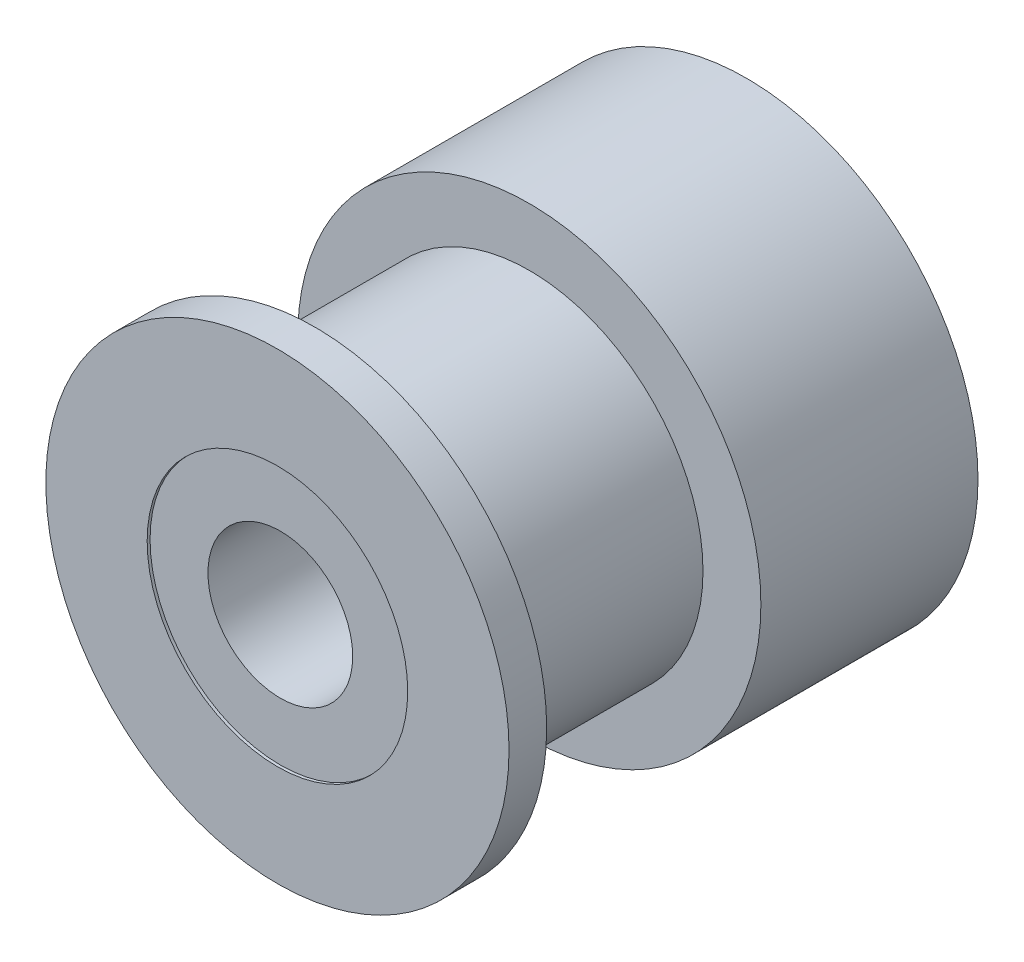
ISO-10303-21;
HEADER;
FILE_DESCRIPTION(('STEP AP214'),'2;1');
FILE_NAME('part.step','',(''),(''),'','','');
FILE_SCHEMA(('AUTOMOTIVE_DESIGN { 1 0 10303 214 1 1 1 1 }'));
ENDSEC;
DATA;
#1=APPLICATION_CONTEXT('core data for automotive mechanical design processes');
#2=APPLICATION_PROTOCOL_DEFINITION('international standard','automotive_design',2000,#1);
#3=PRODUCT_CONTEXT('',#1,'mechanical');
#4=PRODUCT('Part','Part','',(#3));
#5=PRODUCT_RELATED_PRODUCT_CATEGORY('part','',(#4));
#6=PRODUCT_DEFINITION_FORMATION('','',#4);
#7=PRODUCT_DEFINITION_CONTEXT('part definition',#1,'design');
#8=PRODUCT_DEFINITION('design','',#6,#7);
#9=PRODUCT_DEFINITION_SHAPE('','',#8);
#10=(LENGTH_UNIT() NAMED_UNIT(*) SI_UNIT(.MILLI.,.METRE.));
#11=(NAMED_UNIT(*) PLANE_ANGLE_UNIT() SI_UNIT($,.RADIAN.));
#12=(NAMED_UNIT(*) SI_UNIT($,.STERADIAN.) SOLID_ANGLE_UNIT());
#13=UNCERTAINTY_MEASURE_WITH_UNIT(LENGTH_MEASURE(1.E-05),#10,'distance_accuracy_value','');
#14=(GEOMETRIC_REPRESENTATION_CONTEXT(3) GLOBAL_UNCERTAINTY_ASSIGNED_CONTEXT((#13)) GLOBAL_UNIT_ASSIGNED_CONTEXT((#10,
#11,#12)) REPRESENTATION_CONTEXT('',''));
#15=CARTESIAN_POINT('',(0.,0.,0.));
#16=DIRECTION('',(0.,0.,1.));
#17=DIRECTION('',(1.,0.,0.));
#18=AXIS2_PLACEMENT_3D('',#15,#16,#17);
#19=CARTESIAN_POINT('',(0.,0.,-3.8));
#20=DIRECTION('',(0.,0.,1.));
#21=DIRECTION('',(1.,0.,0.));
#22=AXIS2_PLACEMENT_3D('',#19,#20,#21);
#23=CYLINDRICAL_SURFACE('',#22,2.5);
#24=CARTESIAN_POINT('',(0.,-2.5,5.25));
#25=CARTESIAN_POINT('',(-0.0767298334620159,-2.49999625789732,5.24999590899012));
#26=CARTESIAN_POINT('',(-0.153582320644178,-2.4964290461501,5.24407132907373));
#27=CARTESIAN_POINT('',(-0.304975509530679,-2.48249903608568,5.22067568048467));
#28=CARTESIAN_POINT('',(-0.379510034596047,-2.47211948032719,5.20317613814577));
#29=CARTESIAN_POINT('',(-0.523751827790836,-2.44561558054488,5.15761363883314));
#30=CARTESIAN_POINT('',(-0.593481028226566,-2.42951973272944,5.12960304183684));
#31=CARTESIAN_POINT('',(-0.727030318214659,-2.39295367626407,5.06413966685897));
#32=CARTESIAN_POINT('',(-0.790851869416383,-2.37248455380255,5.02668923303125));
#33=CARTESIAN_POINT('',(-0.916299278999315,-2.32705360719088,4.94022517329142));
#34=CARTESIAN_POINT('',(-0.977384020081415,-2.30186792195985,4.89054630464861));
#35=CARTESIAN_POINT('',(-1.09088270411891,-2.25030439279634,4.78253279617173));
#36=CARTESIAN_POINT('',(-1.14328534948112,-2.22392505153571,4.72418706281268));
#37=CARTESIAN_POINT('',(-1.24444996762974,-2.1691106699591,4.59207648950327));
#38=CARTESIAN_POINT('',(-1.29197766378809,-2.14082017703649,4.51729822901871));
#39=CARTESIAN_POINT('',(-1.37361437764896,-2.08938301412124,4.35915342675689));
#40=CARTESIAN_POINT('',(-1.4077451733516,-2.06622802273938,4.27580110375243));
#41=CARTESIAN_POINT('',(-1.45440601714221,-2.0335462966093,4.12340354934676));
#42=CARTESIAN_POINT('',(-1.47016197246826,-2.02207883137591,4.05576400138968));
#43=CARTESIAN_POINT('',(-1.49216172340475,-2.00590308295503,3.91819628416964));
#44=CARTESIAN_POINT('',(-1.49841734556836,-2.00118639643759,3.84827107124551));
#45=CARTESIAN_POINT('',(-1.50105508796009,-1.99920922463856,3.70798850578266));
#46=CARTESIAN_POINT('',(-1.49741783408419,-2.00196337012718,3.6376305749068));
#47=CARTESIAN_POINT('',(-1.48046060478828,-2.01453261443741,3.49872122457241));
#48=CARTESIAN_POINT('',(-1.46713334620103,-2.02435302432226,3.43017120415256));
#49=CARTESIAN_POINT('',(-1.43173921881792,-2.04953186944258,3.2974697578719));
#50=CARTESIAN_POINT('',(-1.40978748666087,-2.06481711652537,3.23327294607552));
#51=CARTESIAN_POINT('',(-1.35795061770837,-2.09927051350828,3.10930500907188));
#52=CARTESIAN_POINT('',(-1.32806257259705,-2.11844008623465,3.04953551657607));
#53=CARTESIAN_POINT('',(-1.25517983184583,-2.16255327268985,2.9250159028772));
#54=CARTESIAN_POINT('',(-1.21080724397723,-2.18792043372992,2.86122190704507));
#55=CARTESIAN_POINT('',(-1.11291092784003,-2.23930599764381,2.74132351633298));
#56=CARTESIAN_POINT('',(-1.05937845100579,-2.26532500262149,2.68522656602349));
#57=CARTESIAN_POINT('',(-0.935811834382966,-2.31935504958317,2.57438701817824));
#58=CARTESIAN_POINT('',(-0.864517682704957,-2.34713836268532,2.52092269398401));
#59=CARTESIAN_POINT('',(-0.712276050459,-2.39772428433981,2.42687795280209));
#60=CARTESIAN_POINT('',(-0.631333763943564,-2.42052955425515,2.38629064621005));
#61=CARTESIAN_POINT('',(-0.467197585268206,-2.45730392066151,2.3220678172041));
#62=CARTESIAN_POINT('',(-0.38446762417358,-2.47173957439704,2.29752464428409));
#63=CARTESIAN_POINT('',(-0.215047895144639,-2.49218842813551,2.26298880259462));
#64=CARTESIAN_POINT('',(-0.128363005661319,-2.49821172952738,2.25297868224642));
#65=CARTESIAN_POINT('',(0.0337146143773965,-2.5009057037461,2.24849215232169));
#66=CARTESIAN_POINT('',(0.109042473418718,-2.49873521714286,2.25209114491483));
#67=CARTESIAN_POINT('',(0.25782940198606,-2.48778712087048,2.27042585307192));
#68=CARTESIAN_POINT('',(0.331288509376106,-2.47900964518037,2.28516134280581));
#69=CARTESIAN_POINT('',(0.472574932157612,-2.4559479244219,2.32454343281246));
#70=CARTESIAN_POINT('',(0.540495750928483,-2.44180275662555,2.34894034907347));
#71=CARTESIAN_POINT('',(0.671265749087262,-2.40913880862844,2.40667737636527));
#72=CARTESIAN_POINT('',(0.734113924963908,-2.39061916586511,2.44001925134667));
#73=CARTESIAN_POINT('',(0.860006262823863,-2.3484549623736,2.51855697920871));
#74=CARTESIAN_POINT('',(0.922394150456836,-2.3244780273988,2.56462382907839));
#75=CARTESIAN_POINT('',(1.03902603131014,-2.27474265574732,2.66539139348862));
#76=CARTESIAN_POINT('',(1.09326040273738,-2.2489821658636,2.72010215485254));
#77=CARTESIAN_POINT('',(1.19931996735579,-2.19445423909891,2.84491039003715));
#78=CARTESIAN_POINT('',(1.24991019630915,-2.16573241746291,2.9160838854655));
#79=CARTESIAN_POINT('',(1.33845238915667,-2.1121618206671,3.0672160245682));
#80=CARTESIAN_POINT('',(1.37641766769781,-2.0873089799769,3.14716529389278));
#81=CARTESIAN_POINT('',(1.43142578795776,-2.04984909240519,3.29624302230669));
#82=CARTESIAN_POINT('',(1.4512162533619,-2.03575659328729,3.36398031235859));
#83=CARTESIAN_POINT('',(1.48113663905972,-2.01409605743544,3.5025320780801));
#84=CARTESIAN_POINT('',(1.49127995297631,-2.00651897642721,3.57334214432783));
#85=CARTESIAN_POINT('',(1.50134130416631,-1.99900446616268,3.71637694759703));
#86=CARTESIAN_POINT('',(1.50122089107869,-1.99909576445937,3.78860599068704));
#87=CARTESIAN_POINT('',(1.49066472959328,-2.0069771789285,3.93189443560946));
#88=CARTESIAN_POINT('',(1.48022337215759,-2.0147714813882,4.00295318008059));
#89=CARTESIAN_POINT('',(1.45040174148913,-2.0363318524298,4.13848841757219));
#90=CARTESIAN_POINT('',(1.43147636845351,-2.0497921180558,4.20311709430687));
#91=CARTESIAN_POINT('',(1.38563242076993,-2.08105501960151,4.32833725447422));
#92=CARTESIAN_POINT('',(1.35871083588479,-2.09885929040482,4.38892720696055));
#93=CARTESIAN_POINT('',(1.29289245555732,-2.14012990550917,4.51431985722078));
#94=CARTESIAN_POINT('',(1.25279167675753,-2.16404587582639,4.57834110385431));
#95=CARTESIAN_POINT('',(1.16375698389085,-2.21320127030768,4.69938007261729));
#96=CARTESIAN_POINT('',(1.11481579607798,-2.23844177205021,4.75639196215255));
#97=CARTESIAN_POINT('',(1.00009777425734,-2.29225690291476,4.87135094913167));
#98=CARTESIAN_POINT('',(0.932876819313905,-2.32070308663658,4.92793107489619));
#99=CARTESIAN_POINT('',(0.78846243444559,-2.37365428872367,5.02909785586331));
#100=CARTESIAN_POINT('',(0.711265444501541,-2.39815789310936,5.07368021198479));
#101=CARTESIAN_POINT('',(0.551125230801456,-2.43985578654394,5.14778580757374));
#102=CARTESIAN_POINT('',(0.468430086957216,-2.45725077479787,5.17772806492683));
#103=CARTESIAN_POINT('',(0.29797330611881,-2.48366273001246,5.22272469521097));
#104=CARTESIAN_POINT('',(0.210232099648614,-2.49271125871485,5.23783516785699));
#105=CARTESIAN_POINT('',(0.101558096917537,-2.49802001168187,5.24669745470866));
#106=CARTESIAN_POINT('',(0.081276259028278,-2.49876114656362,5.2479344173061));
#107=CARTESIAN_POINT('',(0.0406658206871123,-2.49975164517367,5.24958624637086));
#108=CARTESIAN_POINT('',(0.0203372186375694,-2.50000099184316,5.2500010843209));
#109=CARTESIAN_POINT('',(0.,-2.5,5.25));
#110=B_SPLINE_CURVE_WITH_KNOTS('',3,(#24,#25,#26,#27,#28,#29,#30,#31,#32,#33,#34,#35,#36,#37,
#38,#39,#40,#41,#42,#43,#44,#45,#46,#47,#48,#49,#50,#51,#52,#53,#54,#55,#56,#57,#58,#59,#60,#61,
#62,#63,#64,#65,#66,#67,#68,#69,#70,#71,#72,#73,#74,#75,#76,#77,#78,#79,#80,#81,#82,#83,#84,#85,
#86,#87,#88,#89,#90,#91,#92,#93,#94,#95,#96,#97,#98,#99,#100,#101,#102,#103,#104,#105,#106,#107,
#108,#109),.UNSPECIFIED.,.T.,.F.,(4,2,2,2,2,2,2,2,2,2,2,2,2,2,2,2,2,2,2,2,2,2,2,2,2,2,2,2,2,2,2,
2,2,2,2,2,2,2,2,2,2,2,4),(0.,0.230102237548649,0.460772627520012,0.690308884600011,
0.919788197992274,1.16681590732472,1.414162579348,1.69183813189807,1.96906040692092,
2.17933829855633,2.38935420916578,2.59978170870726,2.81036753273872,3.01823267593207,
3.22617409809868,3.47046995225163,3.71500044803674,3.99360957884691,4.27206939275324,
4.53296790696559,4.79355286918236,5.01875602722426,5.24395461863455,5.46367785689772,
5.68344445659025,5.92601365818362,6.16886690081836,6.44336762428009,6.71757792616456,
6.93257787314692,7.14727888733318,7.36278425777433,7.57840681155725,7.78364098331141,
7.98895251523035,8.22578610052286,8.46281544370207,8.73854311775518,9.01436946031985,
9.28175654462676,9.54812832184448,9.60911473335177,9.6701032602764),.UNSPECIFIED.);
#111=CARTESIAN_POINT('',(0.,-2.5,5.25));
#112=VERTEX_POINT('',#111);
#113=EDGE_CURVE('E74',#112,#112,#110,.T.);
#114=ORIENTED_EDGE('',*,*,#113,.T.);
#115=EDGE_LOOP('',(#114));
#116=FACE_BOUND('',#115,.T.);
#117=CARTESIAN_POINT('',(-2.5,0.,2.25));
#118=CARTESIAN_POINT('',(-2.49999625789732,-0.0767298334620158,2.25000409100988));
#119=CARTESIAN_POINT('',(-2.4964290461501,-0.153582320644178,2.25592867092626));
#120=CARTESIAN_POINT('',(-2.48249903608568,-0.304975509530679,2.27932431951533));
#121=CARTESIAN_POINT('',(-2.47211948032719,-0.379510034596047,2.29682386185422));
#122=CARTESIAN_POINT('',(-2.44561558054488,-0.523751827790837,2.34238636116686));
#123=CARTESIAN_POINT('',(-2.42951973272944,-0.593481028226566,2.37039695816316));
#124=CARTESIAN_POINT('',(-2.39295367626407,-0.727030318214659,2.43586033314103));
#125=CARTESIAN_POINT('',(-2.37248455380255,-0.790851869416383,2.47331076696875));
#126=CARTESIAN_POINT('',(-2.32705360719088,-0.916299278999315,2.55977482670858));
#127=CARTESIAN_POINT('',(-2.30186792195985,-0.977384020081415,2.60945369535139));
#128=CARTESIAN_POINT('',(-2.25030439279634,-1.09088270411891,2.71746720382827));
#129=CARTESIAN_POINT('',(-2.22392505153571,-1.14328534948112,2.77581293718732));
#130=CARTESIAN_POINT('',(-2.1691106699591,-1.24444996762974,2.90792351049673));
#131=CARTESIAN_POINT('',(-2.14082017703649,-1.29197766378809,2.98270177098129));
#132=CARTESIAN_POINT('',(-2.08938301412124,-1.37361437764896,3.14084657324311));
#133=CARTESIAN_POINT('',(-2.06622802273938,-1.4077451733516,3.22419889624757));
#134=CARTESIAN_POINT('',(-2.0335462966093,-1.45440601714221,3.37659645065324));
#135=CARTESIAN_POINT('',(-2.02207883137591,-1.47016197246826,3.44423599861032));
#136=CARTESIAN_POINT('',(-2.00590308295503,-1.49216172340475,3.58180371583036));
#137=CARTESIAN_POINT('',(-2.00118639643759,-1.49841734556836,3.65172892875449));
#138=CARTESIAN_POINT('',(-1.99920922463856,-1.50105508796009,3.79201149421733));
#139=CARTESIAN_POINT('',(-2.00196337012718,-1.49741783408419,3.8623694250932));
#140=CARTESIAN_POINT('',(-2.01453261443741,-1.48046060478828,4.00127877542759));
#141=CARTESIAN_POINT('',(-2.02435302432226,-1.46713334620103,4.06982879584744));
#142=CARTESIAN_POINT('',(-2.04953186944258,-1.43173921881792,4.2025302421281));
#143=CARTESIAN_POINT('',(-2.06481711652537,-1.40978748666087,4.26672705392448));
#144=CARTESIAN_POINT('',(-2.09927051350828,-1.35795061770837,4.39069499092812));
#145=CARTESIAN_POINT('',(-2.11844008623465,-1.32806257259705,4.45046448342392));
#146=CARTESIAN_POINT('',(-2.16255327268985,-1.25517983184583,4.5749840971228));
#147=CARTESIAN_POINT('',(-2.18792043372992,-1.21080724397723,4.63877809295493));
#148=CARTESIAN_POINT('',(-2.23930599764381,-1.11291092784003,4.75867648366701));
#149=CARTESIAN_POINT('',(-2.26532500262149,-1.05937845100579,4.8147734339765));
#150=CARTESIAN_POINT('',(-2.31935504958317,-0.935811834382967,4.92561298182176));
#151=CARTESIAN_POINT('',(-2.34713836268532,-0.864517682704958,4.97907730601599));
#152=CARTESIAN_POINT('',(-2.39772428433981,-0.712276050459001,5.07312204719791));
#153=CARTESIAN_POINT('',(-2.42052955425515,-0.631333763943565,5.11370935378995));
#154=CARTESIAN_POINT('',(-2.45730392066151,-0.467197585268207,5.1779321827959));
#155=CARTESIAN_POINT('',(-2.47173957439704,-0.384467624173581,5.20247535571591));
#156=CARTESIAN_POINT('',(-2.49218842813551,-0.21504789514464,5.23701119740538));
#157=CARTESIAN_POINT('',(-2.49821172952738,-0.12836300566132,5.24702131775358));
#158=CARTESIAN_POINT('',(-2.5009057037461,0.033714614377395,5.25150784767831));
#159=CARTESIAN_POINT('',(-2.49873521714286,0.109042473418716,5.24790885508517));
#160=CARTESIAN_POINT('',(-2.48778712087048,0.257829401986059,5.22957414692808));
#161=CARTESIAN_POINT('',(-2.47900964518037,0.331288509376104,5.21483865719419));
#162=CARTESIAN_POINT('',(-2.4559479244219,0.472574932157612,5.17545656718754));
#163=CARTESIAN_POINT('',(-2.44180275662555,0.540495750928482,5.15105965092653));
#164=CARTESIAN_POINT('',(-2.40913880862845,0.671265749087262,5.09332262363473));
#165=CARTESIAN_POINT('',(-2.39061916586511,0.734113924963907,5.05998074865333));
#166=CARTESIAN_POINT('',(-2.3484549623736,0.860006262823863,4.9814430207913));
#167=CARTESIAN_POINT('',(-2.3244780273988,0.922394150456836,4.93537617092161));
#168=CARTESIAN_POINT('',(-2.27474265574732,1.03902603131014,4.83460860651138));
#169=CARTESIAN_POINT('',(-2.2489821658636,1.09326040273738,4.77989784514747));
#170=CARTESIAN_POINT('',(-2.19445423909891,1.19931996735579,4.65508960996285));
#171=CARTESIAN_POINT('',(-2.16573241746291,1.24991019630915,4.5839161145345));
#172=CARTESIAN_POINT('',(-2.1121618206671,1.33845238915667,4.4327839754318));
#173=CARTESIAN_POINT('',(-2.0873089799769,1.37641766769781,4.35283470610722));
#174=CARTESIAN_POINT('',(-2.04984909240519,1.43142578795776,4.20375697769331));
#175=CARTESIAN_POINT('',(-2.03575659328729,1.4512162533619,4.13601968764141));
#176=CARTESIAN_POINT('',(-2.01409605743544,1.48113663905972,3.9974679219199));
#177=CARTESIAN_POINT('',(-2.00651897642721,1.49127995297631,3.92665785567217));
#178=CARTESIAN_POINT('',(-1.99900446616267,1.50134130416631,3.78362305240297));
#179=CARTESIAN_POINT('',(-1.99909576445937,1.50122089107869,3.71139400931296));
#180=CARTESIAN_POINT('',(-2.0069771789285,1.49066472959328,3.56810556439054));
#181=CARTESIAN_POINT('',(-2.0147714813882,1.48022337215759,3.4970468199194));
#182=CARTESIAN_POINT('',(-2.0363318524298,1.45040174148913,3.36151158242781));
#183=CARTESIAN_POINT('',(-2.04979211805581,1.43147636845351,3.29688290569313));
#184=CARTESIAN_POINT('',(-2.08105501960151,1.38563242076993,3.17166274552578));
#185=CARTESIAN_POINT('',(-2.09885929040482,1.35871083588479,3.11107279303945));
#186=CARTESIAN_POINT('',(-2.14012990550917,1.29289245555732,2.98568014277922));
#187=CARTESIAN_POINT('',(-2.16404587582639,1.25279167675753,2.92165889614569));
#188=CARTESIAN_POINT('',(-2.21320127030768,1.16375698389085,2.80061992738271));
#189=CARTESIAN_POINT('',(-2.23844177205021,1.11481579607798,2.74360803784744));
#190=CARTESIAN_POINT('',(-2.29225690291476,1.00009777425734,2.62864905086833));
#191=CARTESIAN_POINT('',(-2.32070308663658,0.932876819313905,2.57206892510381));
#192=CARTESIAN_POINT('',(-2.37365428872367,0.788462434445589,2.47090214413669));
#193=CARTESIAN_POINT('',(-2.39815789310936,0.71126544450154,2.42631978801521));
#194=CARTESIAN_POINT('',(-2.43985578654394,0.551125230801454,2.35221419242626));
#195=CARTESIAN_POINT('',(-2.45725077479787,0.468430086957214,2.32227193507317));
#196=CARTESIAN_POINT('',(-2.48366273001246,0.297973306118808,2.27727530478902));
#197=CARTESIAN_POINT('',(-2.49271125871485,0.210232099648613,2.26216483214301));
#198=CARTESIAN_POINT('',(-2.49802001168187,0.101558096917536,2.25330254529134));
#199=CARTESIAN_POINT('',(-2.49876114656362,0.0812762590282776,2.2520655826939));
#200=CARTESIAN_POINT('',(-2.49975164517367,0.0406658206871124,2.25041375362914));
#201=CARTESIAN_POINT('',(-2.50000099184316,0.0203372186375695,2.2499989156791));
#202=CARTESIAN_POINT('',(-2.5,0.,2.25));
#203=B_SPLINE_CURVE_WITH_KNOTS('',3,(#117,#118,#119,#120,#121,#122,#123,#124,#125,#126,#127,
#128,#129,#130,#131,#132,#133,#134,#135,#136,#137,#138,#139,#140,#141,#142,#143,#144,#145,#146,
#147,#148,#149,#150,#151,#152,#153,#154,#155,#156,#157,#158,#159,#160,#161,#162,#163,#164,#165,
#166,#167,#168,#169,#170,#171,#172,#173,#174,#175,#176,#177,#178,#179,#180,#181,#182,#183,#184,
#185,#186,#187,#188,#189,#190,#191,#192,#193,#194,#195,#196,#197,#198,#199,#200,#201,#202),
.UNSPECIFIED.,.T.,.F.,(4,2,2,2,2,2,2,2,2,2,2,2,2,2,2,2,2,2,2,2,2,2,2,2,2,2,2,2,2,2,2,2,2,2,2,2,
2,2,2,2,2,2,4),(0.,0.230102237548649,0.460772627520012,0.690308884600012,0.919788197992275,
1.16681590732473,1.414162579348,1.69183813189807,1.96906040692092,2.17933829855633,
2.38935420916578,2.59978170870726,2.81036753273872,3.01823267593207,3.22617409809868,
3.47046995225163,3.71500044803674,3.99360957884691,4.27206939275324,4.53296790696559,
4.79355286918236,5.01875602722426,5.24395461863455,5.46367785689772,5.68344445659025,
5.92601365818362,6.16886690081836,6.44336762428009,6.71757792616456,6.93257787314692,
7.14727888733318,7.36278425777433,7.57840681155725,7.78364098331142,7.98895251523035,
8.22578610052286,8.46281544370208,8.73854311775519,9.01436946031985,9.28175654462677,
9.54812832184448,9.60911473335177,9.6701032602764),.UNSPECIFIED.);
#204=CARTESIAN_POINT('',(-2.5,0.,2.25));
#205=VERTEX_POINT('',#204);
#206=EDGE_CURVE('E73',#205,#205,#203,.T.);
#207=ORIENTED_EDGE('',*,*,#206,.T.);
#208=EDGE_LOOP('',(#207));
#209=FACE_BOUND('',#208,.T.);
#210=CARTESIAN_POINT('',(0.,0.,16.1));
#211=DIRECTION('',(0.,0.,1.));
#212=DIRECTION('',(1.,0.,0.));
#213=AXIS2_PLACEMENT_3D('',#210,#211,#212);
#214=CIRCLE('',#213,2.5);
#215=CARTESIAN_POINT('',(2.5,0.,16.1));
#216=VERTEX_POINT('',#215);
#217=EDGE_CURVE('E58',#216,#216,#214,.F.);
#218=ORIENTED_EDGE('',*,*,#217,.F.);
#219=EDGE_LOOP('',(#218));
#220=FACE_BOUND('',#219,.T.);
#221=CARTESIAN_POINT('',(0.,0.,0.0999999999999998));
#222=DIRECTION('',(0.,0.,-1.));
#223=DIRECTION('',(-1.,0.,0.));
#224=AXIS2_PLACEMENT_3D('',#221,#222,#223);
#225=CIRCLE('',#224,2.5);
#226=CARTESIAN_POINT('',(-2.5,0.,0.0999999999999998));
#227=VERTEX_POINT('',#226);
#228=EDGE_CURVE('E63',#227,#227,#225,.F.);
#229=ORIENTED_EDGE('',*,*,#228,.F.);
#230=EDGE_LOOP('',(#229));
#231=FACE_BOUND('',#230,.T.);
#232=ADVANCED_FACE('F32',(#116,#209,#220,#231),#23,.F.);
#233=CARTESIAN_POINT('',(0.,0.,7.5));
#234=DIRECTION('',(0.,0.,-1.));
#235=DIRECTION('',(-1.,0.,0.));
#236=AXIS2_PLACEMENT_3D('',#233,#234,#235);
#237=CYLINDRICAL_SURFACE('',#236,8.);
#238=CARTESIAN_POINT('',(0.,-8.,5.25));
#239=CARTESIAN_POINT('',(0.0834717464654709,-7.99999848833852,5.24999681041172));
#240=CARTESIAN_POINT('',(0.166984992730099,-7.99868009921714,5.24300892338062));
#241=CARTESIAN_POINT('',(0.331658129841798,-7.9935478589052,5.21526000488165));
#242=CARTESIAN_POINT('',(0.412815974152226,-7.98973190166897,5.19448734936027));
#243=CARTESIAN_POINT('',(0.570372961851801,-7.98003138765458,5.13982729874066));
#244=CARTESIAN_POINT('',(0.646776330685344,-7.97414869946483,5.10595174754746));
#245=CARTESIAN_POINT('',(0.792807973094006,-7.96095710599783,5.02608112307718));
#246=CARTESIAN_POINT('',(0.862436794477323,-7.9536483161829,4.98008703085518));
#247=CARTESIAN_POINT('',(0.993783715930503,-7.93831336430504,4.87670023199632));
#248=CARTESIAN_POINT('',(1.05540895503183,-7.93028034856351,4.81919055532986));
#249=CARTESIAN_POINT('',(1.16819606135369,-7.9144531845865,4.69465669091244));
#250=CARTESIAN_POINT('',(1.21935717689241,-7.90665905354527,4.62763182023072));
#251=CARTESIAN_POINT('',(1.31014998665793,-7.89212551245005,4.48531391163603));
#252=CARTESIAN_POINT('',(1.34968721969605,-7.88539493886182,4.40995962968276));
#253=CARTESIAN_POINT('',(1.41550524332283,-7.87384713211987,4.25353108482321));
#254=CARTESIAN_POINT('',(1.44178717713098,-7.86902973396962,4.17245731588878));
#255=CARTESIAN_POINT('',(1.480050535035,-7.8619226957455,4.00788476908559));
#256=CARTESIAN_POINT('',(1.49219390192039,-7.85960445366405,3.92442490279654));
#257=CARTESIAN_POINT('',(1.50233808095346,-7.85767197152761,3.75662261519175));
#258=CARTESIAN_POINT('',(1.50034016135374,-7.8580574889876,3.6722802736977));
#259=CARTESIAN_POINT('',(1.48238979602362,-7.86146292701753,3.50628047473395));
#260=CARTESIAN_POINT('',(1.46662149996045,-7.86444808147334,3.42460228569985));
#261=CARTESIAN_POINT('',(1.42186799396207,-7.87266183284666,3.26507158021739));
#262=CARTESIAN_POINT('',(1.39288222239499,-7.87789052509516,3.1872192264907));
#263=CARTESIAN_POINT('',(1.322336471793,-7.89003855292589,3.03701132099973));
#264=CARTESIAN_POINT('',(1.28070213532456,-7.89696783823366,2.96469152941919));
#265=CARTESIAN_POINT('',(1.18609368930416,-7.91172971602918,2.82799527145977));
#266=CARTESIAN_POINT('',(1.13311842889266,-7.91956240015522,2.7636196122852));
#267=CARTESIAN_POINT('',(1.01633905685298,-7.93540001272164,2.64357504432754));
#268=CARTESIAN_POINT('',(0.952377436860682,-7.94340571024031,2.58805934754826));
#269=CARTESIAN_POINT('',(0.815968037098826,-7.95857386108318,2.48852275932459));
#270=CARTESIAN_POINT('',(0.743520172255769,-7.96573630595245,2.44450198312958));
#271=CARTESIAN_POINT('',(0.592034988874667,-7.97842539677509,2.36918224612998));
#272=CARTESIAN_POINT('',(0.512989564446493,-7.98394999136289,2.3378992208821));
#273=CARTESIAN_POINT('',(0.350639115398696,-7.99272505402719,2.28909790690784));
#274=CARTESIAN_POINT('',(0.267334544277787,-7.99597576367994,2.27157815595464));
#275=CARTESIAN_POINT('',(0.100148652903385,-7.99980360641981,2.25101396898173));
#276=CARTESIAN_POINT('',(0.0162940126341356,-8.00041950912279,2.24775960847027));
#277=CARTESIAN_POINT('',(-0.150761248092184,-7.99901543598228,2.25525547954765));
#278=CARTESIAN_POINT('',(-0.233961900480385,-7.99699558964431,2.26600502306526));
#279=CARTESIAN_POINT('',(-0.396681573218217,-7.99057111500406,2.30102903518337));
#280=CARTESIAN_POINT('',(-0.476224261046063,-7.98618522374031,2.32519728253781));
#281=CARTESIAN_POINT('',(-0.630128631824633,-7.97551842212498,2.38625770677879));
#282=CARTESIAN_POINT('',(-0.704489962595103,-7.96923738311334,2.42315074756579));
#283=CARTESIAN_POINT('',(-0.846816671513214,-7.95538030357666,2.50907812815951));
#284=CARTESIAN_POINT('',(-0.914703277015121,-7.94779086174563,2.55824073853684));
#285=CARTESIAN_POINT('',(-1.04133832326454,-7.93219343489712,2.66713813736236));
#286=CARTESIAN_POINT('',(-1.10008590976087,-7.92418541084687,2.72687391300133));
#287=CARTESIAN_POINT('',(-1.20757295872048,-7.9085247569745,2.85617231891143));
#288=CARTESIAN_POINT('',(-1.25616916218577,-7.90087825860257,2.92585490812539));
#289=CARTESIAN_POINT('',(-1.34096675057787,-7.88692985578532,3.07251762452375));
#290=CARTESIAN_POINT('',(-1.37716859613924,-7.8806279013735,3.14949748037047));
#291=CARTESIAN_POINT('',(-1.43594673512823,-7.87013024209574,3.30820586724254));
#292=CARTESIAN_POINT('',(-1.45858868794786,-7.86592440436878,3.38990937955933));
#293=CARTESIAN_POINT('',(-1.48980679326235,-7.86007203802415,3.5560472225214));
#294=CARTESIAN_POINT('',(-1.49838453270708,-7.8584252206579,3.6404812439704));
#295=CARTESIAN_POINT('',(-1.50117762148355,-7.85789199803857,3.80824833144151));
#296=CARTESIAN_POINT('',(-1.49561895003499,-7.85896215974293,3.891577580957));
#297=CARTESIAN_POINT('',(-1.47079175378803,-7.86364600659998,4.05609142204529));
#298=CARTESIAN_POINT('',(-1.45152331089332,-7.86725967655747,4.13727602642744));
#299=CARTESIAN_POINT('',(-1.39991887583263,-7.8766050802318,4.29507448479548));
#300=CARTESIAN_POINT('',(-1.36760735397252,-7.88233284594965,4.37169659134577));
#301=CARTESIAN_POINT('',(-1.29085868912204,-7.8952638755184,4.51846825424084));
#302=CARTESIAN_POINT('',(-1.24642068948186,-7.90246724360119,4.58861735284478));
#303=CARTESIAN_POINT('',(-1.14589487339535,-7.91767266107745,4.72158368004229));
#304=CARTESIAN_POINT('',(-1.08964259864303,-7.92568505353043,4.7842754125671));
#305=CARTESIAN_POINT('',(-0.967427926742291,-7.94152833918735,4.89940516246452));
#306=CARTESIAN_POINT('',(-0.901463301891616,-7.94935919027328,4.95184082098014));
#307=CARTESIAN_POINT('',(-0.760984945071873,-7.96403975968049,5.04541095262706));
#308=CARTESIAN_POINT('',(-0.686399590640517,-7.97088000990561,5.08643942849064));
#309=CARTESIAN_POINT('',(-0.531290113653834,-7.98271619380687,5.15531763660513));
#310=CARTESIAN_POINT('',(-0.450771651705248,-7.98771385879037,5.18317974704691));
#311=CARTESIAN_POINT('',(-0.308347202825154,-7.99428290707632,5.21927731441868));
#312=CARTESIAN_POINT('',(-0.247273810251871,-7.99641470878206,5.2307786303128));
#313=CARTESIAN_POINT('',(-0.124141247115159,-7.9992737995401,5.24614106211645));
#314=CARTESIAN_POINT('',(-0.0620821016527098,-8.00000112429805,5.25000237225591));
#315=CARTESIAN_POINT('',(0.,-8.,5.25));
#316=B_SPLINE_CURVE_WITH_KNOTS('',3,(#238,#239,#240,#241,#242,#243,#244,#245,#246,#247,#248,
#249,#250,#251,#252,#253,#254,#255,#256,#257,#258,#259,#260,#261,#262,#263,#264,#265,#266,#267,
#268,#269,#270,#271,#272,#273,#274,#275,#276,#277,#278,#279,#280,#281,#282,#283,#284,#285,#286,
#287,#288,#289,#290,#291,#292,#293,#294,#295,#296,#297,#298,#299,#300,#301,#302,#303,#304,#305,
#306,#307,#308,#309,#310,#311,#312,#313,#314,#315),.UNSPECIFIED.,.T.,.F.,(4,2,2,2,2,2,2,2,2,2,2,
2,2,2,2,2,2,2,2,2,2,2,2,2,2,2,2,2,2,2,2,2,2,2,2,2,2,2,4),(0.,0.250188200964924,
0.500587642535452,0.750761271230907,1.00091465336891,1.2537511801363,1.50660586283616,
1.76146190504357,2.01629596311948,2.26818151445336,2.52004447587256,2.76859000612765,
3.01714609846787,3.26719262629531,3.51726454049859,3.77127768464077,4.02529337544948,
4.27962588321699,4.53393136673745,4.78448174076096,5.03501980464583,5.28360233907828,
5.53220175338031,5.78351778017708,6.03485728413098,6.28953436987299,6.54420198954945,
6.79762627818559,7.05102196946512,7.30039252231748,7.54976158541507,7.79866496207692,
8.04758592655423,8.3002336996638,8.55293951262255,8.80792048916314,9.06266126931173,
9.24874344524409,9.4348208903954),.UNSPECIFIED.);
#317=CARTESIAN_POINT('',(0.,-8.,5.25));
#318=VERTEX_POINT('',#317);
#319=EDGE_CURVE('E37',#318,#318,#316,.T.);
#320=ORIENTED_EDGE('',*,*,#319,.T.);
#321=EDGE_LOOP('',(#320));
#322=FACE_BOUND('',#321,.T.);
#323=CARTESIAN_POINT('',(-8.,0.,5.25));
#324=CARTESIAN_POINT('',(-7.99999848833852,-0.0834717464654708,5.24999681041172));
#325=CARTESIAN_POINT('',(-7.99868009921714,-0.166984992730098,5.24300892338062));
#326=CARTESIAN_POINT('',(-7.9935478589052,-0.331658129841797,5.21526000488165));
#327=CARTESIAN_POINT('',(-7.98973190166897,-0.412815974152225,5.19448734936027));
#328=CARTESIAN_POINT('',(-7.98003138765458,-0.570372961851801,5.13982729874066));
#329=CARTESIAN_POINT('',(-7.97414869946483,-0.646776330685343,5.10595174754746));
#330=CARTESIAN_POINT('',(-7.96095710599783,-0.792807973094006,5.02608112307718));
#331=CARTESIAN_POINT('',(-7.9536483161829,-0.862436794477323,4.98008703085518));
#332=CARTESIAN_POINT('',(-7.93831336430504,-0.993783715930503,4.87670023199632));
#333=CARTESIAN_POINT('',(-7.93028034856351,-1.05540895503183,4.81919055532986));
#334=CARTESIAN_POINT('',(-7.9144531845865,-1.16819606135369,4.69465669091244));
#335=CARTESIAN_POINT('',(-7.90665905354527,-1.21935717689242,4.62763182023071));
#336=CARTESIAN_POINT('',(-7.89212551245005,-1.31014998665793,4.48531391163603));
#337=CARTESIAN_POINT('',(-7.88539493886182,-1.34968721969605,4.40995962968276));
#338=CARTESIAN_POINT('',(-7.87384713211987,-1.41550524332283,4.25353108482321));
#339=CARTESIAN_POINT('',(-7.86902973396962,-1.44178717713098,4.17245731588878));
#340=CARTESIAN_POINT('',(-7.8619226957455,-1.480050535035,4.00788476908559));
#341=CARTESIAN_POINT('',(-7.85960445366405,-1.49219390192039,3.92442490279654));
#342=CARTESIAN_POINT('',(-7.85767197152761,-1.50233808095346,3.75662261519175));
#343=CARTESIAN_POINT('',(-7.8580574889876,-1.50034016135374,3.6722802736977));
#344=CARTESIAN_POINT('',(-7.86146292701753,-1.48238979602362,3.50628047473395));
#345=CARTESIAN_POINT('',(-7.86444808147334,-1.46662149996045,3.42460228569985));
#346=CARTESIAN_POINT('',(-7.87266183284666,-1.42186799396207,3.26507158021739));
#347=CARTESIAN_POINT('',(-7.87789052509516,-1.39288222239499,3.1872192264907));
#348=CARTESIAN_POINT('',(-7.89003855292589,-1.322336471793,3.03701132099973));
#349=CARTESIAN_POINT('',(-7.89696783823366,-1.28070213532456,2.96469152941919));
#350=CARTESIAN_POINT('',(-7.91172971602918,-1.18609368930416,2.82799527145977));
#351=CARTESIAN_POINT('',(-7.91956240015522,-1.13311842889266,2.7636196122852));
#352=CARTESIAN_POINT('',(-7.93540001272164,-1.01633905685298,2.64357504432754));
#353=CARTESIAN_POINT('',(-7.94340571024031,-0.952377436860682,2.58805934754826));
#354=CARTESIAN_POINT('',(-7.95857386108318,-0.815968037098826,2.48852275932459));
#355=CARTESIAN_POINT('',(-7.96573630595245,-0.743520172255769,2.44450198312958));
#356=CARTESIAN_POINT('',(-7.97842539677509,-0.592034988874667,2.36918224612998));
#357=CARTESIAN_POINT('',(-7.98394999136289,-0.512989564446493,2.3378992208821));
#358=CARTESIAN_POINT('',(-7.99272505402719,-0.350639115398696,2.28909790690784));
#359=CARTESIAN_POINT('',(-7.99597576367994,-0.267334544277786,2.27157815595464));
#360=CARTESIAN_POINT('',(-7.99980360641981,-0.100148652903384,2.25101396898173));
#361=CARTESIAN_POINT('',(-8.00041950912279,-0.0162940126341345,2.24775960847027));
#362=CARTESIAN_POINT('',(-7.99901543598228,0.150761248092185,2.25525547954765));
#363=CARTESIAN_POINT('',(-7.99699558964431,0.233961900480386,2.26600502306526));
#364=CARTESIAN_POINT('',(-7.99057111500406,0.396681573218218,2.30102903518337));
#365=CARTESIAN_POINT('',(-7.98618522374031,0.476224261046064,2.32519728253781));
#366=CARTESIAN_POINT('',(-7.97551842212498,0.630128631824634,2.38625770677879));
#367=CARTESIAN_POINT('',(-7.96923738311334,0.704489962595104,2.42315074756579));
#368=CARTESIAN_POINT('',(-7.95538030357666,0.846816671513215,2.50907812815951));
#369=CARTESIAN_POINT('',(-7.94779086174563,0.914703277015122,2.55824073853684));
#370=CARTESIAN_POINT('',(-7.93219343489712,1.04133832326455,2.66713813736236));
#371=CARTESIAN_POINT('',(-7.92418541084687,1.10008590976087,2.72687391300133));
#372=CARTESIAN_POINT('',(-7.9085247569745,1.20757295872048,2.85617231891143));
#373=CARTESIAN_POINT('',(-7.90087825860257,1.25616916218577,2.92585490812539));
#374=CARTESIAN_POINT('',(-7.88692985578532,1.34096675057787,3.07251762452375));
#375=CARTESIAN_POINT('',(-7.8806279013735,1.37716859613924,3.14949748037047));
#376=CARTESIAN_POINT('',(-7.87013024209574,1.43594673512823,3.30820586724254));
#377=CARTESIAN_POINT('',(-7.86592440436878,1.45858868794786,3.38990937955933));
#378=CARTESIAN_POINT('',(-7.86007203802415,1.48980679326235,3.5560472225214));
#379=CARTESIAN_POINT('',(-7.8584252206579,1.49838453270708,3.6404812439704));
#380=CARTESIAN_POINT('',(-7.85789199803857,1.50117762148355,3.80824833144151));
#381=CARTESIAN_POINT('',(-7.85896215974293,1.49561895003499,3.891577580957));
#382=CARTESIAN_POINT('',(-7.86364600659998,1.47079175378803,4.05609142204529));
#383=CARTESIAN_POINT('',(-7.86725967655747,1.45152331089332,4.13727602642744));
#384=CARTESIAN_POINT('',(-7.8766050802318,1.39991887583263,4.29507448479548));
#385=CARTESIAN_POINT('',(-7.88233284594965,1.36760735397252,4.37169659134577));
#386=CARTESIAN_POINT('',(-7.8952638755184,1.29085868912204,4.51846825424084));
#387=CARTESIAN_POINT('',(-7.90246724360119,1.24642068948186,4.58861735284478));
#388=CARTESIAN_POINT('',(-7.91767266107745,1.14589487339535,4.7215836800423));
#389=CARTESIAN_POINT('',(-7.92568505353043,1.08964259864303,4.7842754125671));
#390=CARTESIAN_POINT('',(-7.94152833918735,0.96742792674229,4.89940516246452));
#391=CARTESIAN_POINT('',(-7.94935919027328,0.901463301891615,4.95184082098014));
#392=CARTESIAN_POINT('',(-7.96403975968049,0.760984945071872,5.04541095262706));
#393=CARTESIAN_POINT('',(-7.97088000990561,0.686399590640516,5.08643942849064));
#394=CARTESIAN_POINT('',(-7.98271619380687,0.531290113653833,5.15531763660513));
#395=CARTESIAN_POINT('',(-7.98771385879037,0.450771651705248,5.18317974704691));
#396=CARTESIAN_POINT('',(-7.99428290707632,0.308347202825154,5.21927731441867));
#397=CARTESIAN_POINT('',(-7.99641470878206,0.247273810251871,5.2307786303128));
#398=CARTESIAN_POINT('',(-7.9992737995401,0.124141247115159,5.24614106211645));
#399=CARTESIAN_POINT('',(-8.00000112429805,0.0620821016527098,5.25000237225591));
#400=CARTESIAN_POINT('',(-8.,0.,5.25));
#401=B_SPLINE_CURVE_WITH_KNOTS('',3,(#323,#324,#325,#326,#327,#328,#329,#330,#331,#332,#333,
#334,#335,#336,#337,#338,#339,#340,#341,#342,#343,#344,#345,#346,#347,#348,#349,#350,#351,#352,
#353,#354,#355,#356,#357,#358,#359,#360,#361,#362,#363,#364,#365,#366,#367,#368,#369,#370,#371,
#372,#373,#374,#375,#376,#377,#378,#379,#380,#381,#382,#383,#384,#385,#386,#387,#388,#389,#390,
#391,#392,#393,#394,#395,#396,#397,#398,#399,#400),.UNSPECIFIED.,.T.,.F.,(4,2,2,2,2,2,2,2,2,2,2,
2,2,2,2,2,2,2,2,2,2,2,2,2,2,2,2,2,2,2,2,2,2,2,2,2,2,2,4),(0.,0.250188200964924,
0.500587642535452,0.750761271230907,1.00091465336891,1.2537511801363,1.50660586283617,
1.76146190504357,2.01629596311948,2.26818151445336,2.52004447587256,2.76859000612766,
3.01714609846787,3.26719262629531,3.51726454049859,3.77127768464077,4.02529337544948,
4.27962588321699,4.53393136673745,4.78448174076097,5.03501980464583,5.28360233907828,
5.53220175338032,5.78351778017708,6.03485728413098,6.28953436987299,6.54420198954945,
6.79762627818559,7.05102196946513,7.30039252231748,7.54976158541507,7.79866496207693,
8.04758592655423,8.3002336996638,8.55293951262255,8.80792048916314,9.06266126931173,
9.24874344524409,9.43482089039541),.UNSPECIFIED.);
#402=CARTESIAN_POINT('',(-8.,0.,5.25));
#403=VERTEX_POINT('',#402);
#404=EDGE_CURVE('E67',#403,#403,#401,.T.);
#405=ORIENTED_EDGE('',*,*,#404,.T.);
#406=EDGE_LOOP('',(#405));
#407=FACE_BOUND('',#406,.T.);
#408=CARTESIAN_POINT('',(0.,0.,7.5));
#409=DIRECTION('',(0.,0.,1.));
#410=DIRECTION('',(1.,0.,0.));
#411=AXIS2_PLACEMENT_3D('',#408,#409,#410);
#412=CIRCLE('',#411,8.);
#413=CARTESIAN_POINT('',(8.,0.,7.5));
#414=VERTEX_POINT('',#413);
#415=EDGE_CURVE('E45',#414,#414,#412,.T.);
#416=ORIENTED_EDGE('',*,*,#415,.F.);
#417=EDGE_LOOP('',(#416));
#418=FACE_BOUND('',#417,.T.);
#419=CARTESIAN_POINT('',(0.,0.,0.));
#420=DIRECTION('',(0.,0.,1.));
#421=DIRECTION('',(1.,0.,0.));
#422=AXIS2_PLACEMENT_3D('',#419,#420,#421);
#423=CIRCLE('',#422,8.);
#424=CARTESIAN_POINT('',(8.,0.,0.));
#425=VERTEX_POINT('',#424);
#426=EDGE_CURVE('E50',#425,#425,#423,.T.);
#427=ORIENTED_EDGE('',*,*,#426,.T.);
#428=EDGE_LOOP('',(#427));
#429=FACE_BOUND('',#428,.T.);
#430=ADVANCED_FACE('F34',(#322,#407,#418,#429),#237,.T.);
#431=CARTESIAN_POINT('',(0.,0.,7.5));
#432=DIRECTION('',(0.,0.,1.));
#433=DIRECTION('',(1.,0.,0.));
#434=AXIS2_PLACEMENT_3D('',#431,#432,#433);
#435=PLANE('',#434);
#436=CARTESIAN_POINT('',(0.,0.,7.5));
#437=DIRECTION('',(0.,0.,1.));
#438=DIRECTION('',(1.,0.,0.));
#439=AXIS2_PLACEMENT_3D('',#436,#437,#438);
#440=CIRCLE('',#439,6.);
#441=CARTESIAN_POINT('',(6.,0.,7.5));
#442=VERTEX_POINT('',#441);
#443=EDGE_CURVE('E10',#442,#442,#440,.T.);
#444=ORIENTED_EDGE('',*,*,#443,.F.);
#445=EDGE_LOOP('',(#444));
#446=FACE_BOUND('',#445,.T.);
#447=ORIENTED_EDGE('',*,*,#415,.T.);
#448=EDGE_LOOP('',(#447));
#449=FACE_BOUND('',#448,.T.);
#450=ADVANCED_FACE('F125',(#446,#449),#435,.T.);
#451=CARTESIAN_POINT('',(0.,0.,0.));
#452=DIRECTION('',(0.,0.,1.));
#453=DIRECTION('',(1.,0.,0.));
#454=AXIS2_PLACEMENT_3D('',#451,#452,#453);
#455=PLANE('',#454);
#456=CARTESIAN_POINT('',(0.,0.,0.));
#457=DIRECTION('',(0.,0.,-1.));
#458=DIRECTION('',(-1.,0.,0.));
#459=AXIS2_PLACEMENT_3D('',#456,#457,#458);
#460=CIRCLE('',#459,4.5);
#461=CARTESIAN_POINT('',(-4.5,0.,0.));
#462=VERTEX_POINT('',#461);
#463=EDGE_CURVE('E94',#462,#462,#460,.T.);
#464=ORIENTED_EDGE('',*,*,#463,.F.);
#465=EDGE_LOOP('',(#464));
#466=FACE_BOUND('',#465,.T.);
#467=ORIENTED_EDGE('',*,*,#426,.F.);
#468=EDGE_LOOP('',(#467));
#469=FACE_BOUND('',#468,.T.);
#470=ADVANCED_FACE('F123',(#466,#469),#455,.F.);
#471=CARTESIAN_POINT('',(0.,0.,14.9));
#472=DIRECTION('',(0.,0.,-1.));
#473=DIRECTION('',(-1.,0.,0.));
#474=AXIS2_PLACEMENT_3D('',#471,#472,#473);
#475=CYLINDRICAL_SURFACE('',#474,6.);
#476=CARTESIAN_POINT('',(0.,0.,14.9));
#477=DIRECTION('',(0.,0.,1.));
#478=DIRECTION('',(1.,0.,0.));
#479=AXIS2_PLACEMENT_3D('',#476,#477,#478);
#480=CIRCLE('',#479,6.);
#481=CARTESIAN_POINT('',(6.,0.,14.9));
#482=VERTEX_POINT('',#481);
#483=EDGE_CURVE('E53',#482,#482,#480,.T.);
#484=ORIENTED_EDGE('',*,*,#483,.F.);
#485=EDGE_LOOP('',(#484));
#486=FACE_BOUND('',#485,.T.);
#487=ORIENTED_EDGE('',*,*,#443,.T.);
#488=EDGE_LOOP('',(#487));
#489=FACE_BOUND('',#488,.T.);
#490=ADVANCED_FACE('F119',(#486,#489),#475,.T.);
#491=CARTESIAN_POINT('',(0.,0.,16.2));
#492=DIRECTION('',(0.,0.,-1.));
#493=DIRECTION('',(-1.,0.,0.));
#494=AXIS2_PLACEMENT_3D('',#491,#492,#493);
#495=CYLINDRICAL_SURFACE('',#494,8.);
#496=CARTESIAN_POINT('',(0.,0.,16.2));
#497=DIRECTION('',(0.,0.,1.));
#498=DIRECTION('',(1.,0.,0.));
#499=AXIS2_PLACEMENT_3D('',#496,#497,#498);
#500=CIRCLE('',#499,8.);
#501=CARTESIAN_POINT('',(8.,0.,16.2));
#502=VERTEX_POINT('',#501);
#503=EDGE_CURVE('E172',#502,#502,#500,.T.);
#504=ORIENTED_EDGE('',*,*,#503,.F.);
#505=EDGE_LOOP('',(#504));
#506=FACE_BOUND('',#505,.T.);
#507=CARTESIAN_POINT('',(0.,0.,14.9));
#508=DIRECTION('',(0.,0.,1.));
#509=DIRECTION('',(1.,0.,0.));
#510=AXIS2_PLACEMENT_3D('',#507,#508,#509);
#511=CIRCLE('',#510,8.);
#512=CARTESIAN_POINT('',(8.,0.,14.9));
#513=VERTEX_POINT('',#512);
#514=EDGE_CURVE('E61',#513,#513,#511,.T.);
#515=ORIENTED_EDGE('',*,*,#514,.T.);
#516=EDGE_LOOP('',(#515));
#517=FACE_BOUND('',#516,.T.);
#518=ADVANCED_FACE('F111',(#506,#517),#495,.T.);
#519=CARTESIAN_POINT('',(0.,0.,16.2));
#520=DIRECTION('',(0.,0.,1.));
#521=DIRECTION('',(1.,0.,0.));
#522=AXIS2_PLACEMENT_3D('',#519,#520,#521);
#523=PLANE('',#522);
#524=CARTESIAN_POINT('',(0.,0.,16.2));
#525=DIRECTION('',(0.,0.,1.));
#526=DIRECTION('',(1.,0.,0.));
#527=AXIS2_PLACEMENT_3D('',#524,#525,#526);
#528=CIRCLE('',#527,4.5);
#529=CARTESIAN_POINT('',(4.5,0.,16.2));
#530=VERTEX_POINT('',#529);
#531=EDGE_CURVE('E65',#530,#530,#528,.T.);
#532=ORIENTED_EDGE('',*,*,#531,.F.);
#533=EDGE_LOOP('',(#532));
#534=FACE_BOUND('',#533,.T.);
#535=ORIENTED_EDGE('',*,*,#503,.T.);
#536=EDGE_LOOP('',(#535));
#537=FACE_BOUND('',#536,.T.);
#538=ADVANCED_FACE('F106',(#534,#537),#523,.T.);
#539=CARTESIAN_POINT('',(0.,0.,14.9));
#540=DIRECTION('',(0.,0.,1.));
#541=DIRECTION('',(1.,0.,0.));
#542=AXIS2_PLACEMENT_3D('',#539,#540,#541);
#543=PLANE('',#542);
#544=ORIENTED_EDGE('',*,*,#483,.T.);
#545=EDGE_LOOP('',(#544));
#546=FACE_BOUND('',#545,.T.);
#547=ORIENTED_EDGE('',*,*,#514,.F.);
#548=EDGE_LOOP('',(#547));
#549=FACE_BOUND('',#548,.T.);
#550=ADVANCED_FACE('F110',(#546,#549),#543,.F.);
#551=CARTESIAN_POINT('',(0.,0.,16.1));
#552=DIRECTION('',(0.,0.,1.));
#553=DIRECTION('',(1.,0.,0.));
#554=AXIS2_PLACEMENT_3D('',#551,#552,#553);
#555=PLANE('',#554);
#556=CARTESIAN_POINT('',(0.,0.,16.1));
#557=DIRECTION('',(0.,0.,1.));
#558=DIRECTION('',(1.,0.,0.));
#559=AXIS2_PLACEMENT_3D('',#556,#557,#558);
#560=CIRCLE('',#559,4.5);
#561=CARTESIAN_POINT('',(4.5,0.,16.1));
#562=VERTEX_POINT('',#561);
#563=EDGE_CURVE('E62',#562,#562,#560,.T.);
#564=ORIENTED_EDGE('',*,*,#563,.T.);
#565=EDGE_LOOP('',(#564));
#566=FACE_BOUND('',#565,.T.);
#567=ORIENTED_EDGE('',*,*,#217,.T.);
#568=EDGE_LOOP('',(#567));
#569=FACE_BOUND('',#568,.T.);
#570=ADVANCED_FACE('F115',(#566,#569),#555,.T.);
#571=CARTESIAN_POINT('',(0.,0.,16.1));
#572=DIRECTION('',(0.,0.,1.));
#573=DIRECTION('',(1.,0.,0.));
#574=AXIS2_PLACEMENT_3D('',#571,#572,#573);
#575=CYLINDRICAL_SURFACE('',#574,4.5);
#576=ORIENTED_EDGE('',*,*,#563,.F.);
#577=EDGE_LOOP('',(#576));
#578=FACE_BOUND('',#577,.T.);
#579=ORIENTED_EDGE('',*,*,#531,.T.);
#580=EDGE_LOOP('',(#579));
#581=FACE_BOUND('',#580,.T.);
#582=ADVANCED_FACE('F104',(#578,#581),#575,.F.);
#583=CARTESIAN_POINT('',(0.,0.,0.1));
#584=DIRECTION('',(0.,0.,-1.));
#585=DIRECTION('',(-1.,0.,0.));
#586=AXIS2_PLACEMENT_3D('',#583,#584,#585);
#587=PLANE('',#586);
#588=CARTESIAN_POINT('',(0.,0.,0.1));
#589=DIRECTION('',(0.,0.,-1.));
#590=DIRECTION('',(-1.,0.,0.));
#591=AXIS2_PLACEMENT_3D('',#588,#589,#590);
#592=CIRCLE('',#591,4.5);
#593=CARTESIAN_POINT('',(-4.5,0.,0.1));
#594=VERTEX_POINT('',#593);
#595=EDGE_CURVE('E66',#594,#594,#592,.T.);
#596=ORIENTED_EDGE('',*,*,#595,.T.);
#597=EDGE_LOOP('',(#596));
#598=FACE_BOUND('',#597,.T.);
#599=ORIENTED_EDGE('',*,*,#228,.T.);
#600=EDGE_LOOP('',(#599));
#601=FACE_BOUND('',#600,.T.);
#602=ADVANCED_FACE('F83',(#598,#601),#587,.T.);
#603=CARTESIAN_POINT('',(0.,0.,0.1));
#604=DIRECTION('',(0.,0.,-1.));
#605=DIRECTION('',(-1.,0.,0.));
#606=AXIS2_PLACEMENT_3D('',#603,#604,#605);
#607=CYLINDRICAL_SURFACE('',#606,4.5);
#608=ORIENTED_EDGE('',*,*,#595,.F.);
#609=EDGE_LOOP('',(#608));
#610=FACE_BOUND('',#609,.T.);
#611=ORIENTED_EDGE('',*,*,#463,.T.);
#612=EDGE_LOOP('',(#611));
#613=FACE_BOUND('',#612,.T.);
#614=ADVANCED_FACE('F80',(#610,#613),#607,.F.);
#615=CARTESIAN_POINT('',(-20.,0.,3.75));
#616=DIRECTION('',(1.,0.,0.));
#617=DIRECTION('',(0.,0.,-1.));
#618=AXIS2_PLACEMENT_3D('',#615,#616,#617);
#619=CYLINDRICAL_SURFACE('',#618,1.5);
#620=ORIENTED_EDGE('',*,*,#404,.F.);
#621=EDGE_LOOP('',(#620));
#622=FACE_BOUND('',#621,.T.);
#623=ORIENTED_EDGE('',*,*,#206,.F.);
#624=EDGE_LOOP('',(#623));
#625=FACE_BOUND('',#624,.T.);
#626=ADVANCED_FACE('F75',(#622,#625),#619,.F.);
#627=CARTESIAN_POINT('',(0.,-20.,3.75));
#628=DIRECTION('',(0.,1.,0.));
#629=DIRECTION('',(0.,0.,1.));
#630=AXIS2_PLACEMENT_3D('',#627,#628,#629);
#631=CYLINDRICAL_SURFACE('',#630,1.5);
#632=ORIENTED_EDGE('',*,*,#319,.F.);
#633=EDGE_LOOP('',(#632));
#634=FACE_BOUND('',#633,.T.);
#635=ORIENTED_EDGE('',*,*,#113,.F.);
#636=EDGE_LOOP('',(#635));
#637=FACE_BOUND('',#636,.T.);
#638=ADVANCED_FACE('F79',(#634,#637),#631,.F.);
#639=CLOSED_SHELL('',(#232,#430,#450,#470,#490,#518,#538,#550,#570,#582,#602,#614,#626,#638));
#640=MANIFOLD_SOLID_BREP('B2',#639);
#641=ADVANCED_BREP_SHAPE_REPRESENTATION('',(#18,#640),#14);
#642=SHAPE_DEFINITION_REPRESENTATION(#9,#641);
ENDSEC;
END-ISO-10303-21;
